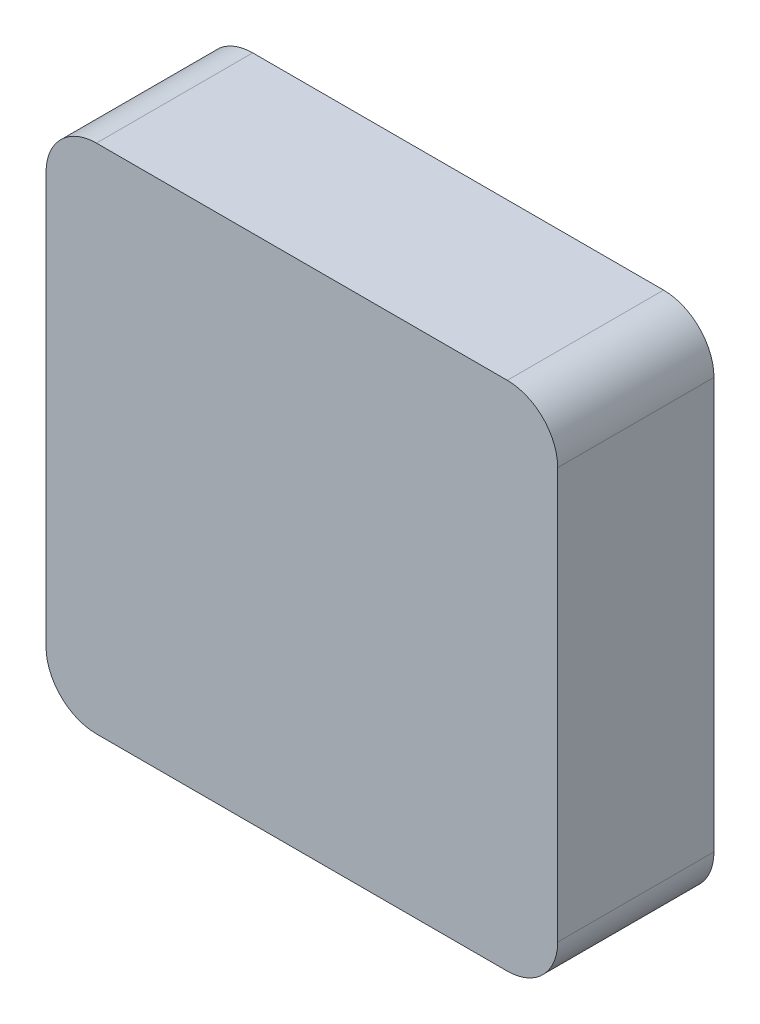
ISO-10303-21;
HEADER;
FILE_DESCRIPTION(('STEP AP214'),'2;1');
FILE_NAME('part.step','',(''),(''),'','','');
FILE_SCHEMA(('AUTOMOTIVE_DESIGN { 1 0 10303 214 1 1 1 1 }'));
ENDSEC;
DATA;
#1=APPLICATION_CONTEXT('core data for automotive mechanical design processes');
#2=APPLICATION_PROTOCOL_DEFINITION('international standard','automotive_design',2000,#1);
#3=PRODUCT_CONTEXT('',#1,'mechanical');
#4=PRODUCT('Part','Part','',(#3));
#5=PRODUCT_RELATED_PRODUCT_CATEGORY('part','',(#4));
#6=PRODUCT_DEFINITION_FORMATION('','',#4);
#7=PRODUCT_DEFINITION_CONTEXT('part definition',#1,'design');
#8=PRODUCT_DEFINITION('design','',#6,#7);
#9=PRODUCT_DEFINITION_SHAPE('','',#8);
#10=(LENGTH_UNIT() NAMED_UNIT(*) SI_UNIT(.MILLI.,.METRE.));
#11=(NAMED_UNIT(*) PLANE_ANGLE_UNIT() SI_UNIT($,.RADIAN.));
#12=(NAMED_UNIT(*) SI_UNIT($,.STERADIAN.) SOLID_ANGLE_UNIT());
#13=UNCERTAINTY_MEASURE_WITH_UNIT(LENGTH_MEASURE(1.E-05),#10,'distance_accuracy_value','');
#14=(GEOMETRIC_REPRESENTATION_CONTEXT(3) GLOBAL_UNCERTAINTY_ASSIGNED_CONTEXT((#13)) GLOBAL_UNIT_ASSIGNED_CONTEXT((#10,
#11,#12)) REPRESENTATION_CONTEXT('',''));
#15=CARTESIAN_POINT('',(0.,0.,0.));
#16=DIRECTION('',(0.,0.,1.));
#17=DIRECTION('',(1.,0.,0.));
#18=AXIS2_PLACEMENT_3D('',#15,#16,#17);
#19=CARTESIAN_POINT('',(-12.45,11.25,2.5));
#20=DIRECTION('',(0.,0.,1.));
#21=DIRECTION('',(1.,0.,0.));
#22=AXIS2_PLACEMENT_3D('',#19,#20,#21);
#23=PLANE('',#22);
#24=CARTESIAN_POINT('',(-16.52500000001,15.32500000001,2.50000000001));
#25=DIRECTION('',(0.,0.,1.));
#26=DIRECTION('',(0.,1.,0.));
#27=AXIS2_PLACEMENT_3D('',#24,#25,#26);
#28=CIRCLE('',#27,1.00000000001);
#29=CARTESIAN_POINT('',(-16.525,16.325,2.5));
#30=VERTEX_POINT('',#29);
#31=CARTESIAN_POINT('',(-17.525,15.325,2.5));
#32=VERTEX_POINT('',#31);
#33=EDGE_CURVE('E136',#30,#32,#28,.T.);
#34=ORIENTED_EDGE('',*,*,#33,.F.);
#35=DIRECTION('',(-1.,0.,0.));
#36=VECTOR('',#35,1.);
#37=CARTESIAN_POINT('',(-8.37500000001,16.32500000001,2.50000000001));
#38=LINE('',#37,#36);
#39=CARTESIAN_POINT('',(-8.375,16.325,2.5));
#40=VERTEX_POINT('',#39);
#41=EDGE_CURVE('E41',#40,#30,#38,.T.);
#42=ORIENTED_EDGE('',*,*,#41,.F.);
#43=CARTESIAN_POINT('',(-8.37500000001,15.32500000001,2.50000000001));
#44=DIRECTION('',(0.,0.,1.));
#45=DIRECTION('',(1.,0.,0.));
#46=AXIS2_PLACEMENT_3D('',#43,#44,#45);
#47=CIRCLE('',#46,1.00000000001);
#48=CARTESIAN_POINT('',(-7.375,15.325,2.5));
#49=VERTEX_POINT('',#48);
#50=EDGE_CURVE('E110',#49,#40,#47,.T.);
#51=ORIENTED_EDGE('',*,*,#50,.F.);
#52=DIRECTION('',(0.,1.,0.));
#53=VECTOR('',#52,1.);
#54=CARTESIAN_POINT('',(-7.37500000001,7.17500000001,2.50000000001));
#55=LINE('',#54,#53);
#56=CARTESIAN_POINT('',(-7.375,7.175,2.5));
#57=VERTEX_POINT('',#56);
#58=EDGE_CURVE('E99',#57,#49,#55,.T.);
#59=ORIENTED_EDGE('',*,*,#58,.F.);
#60=CARTESIAN_POINT('',(-8.37500000001,7.17500000001,2.50000000001));
#61=DIRECTION('',(0.,0.,1.));
#62=DIRECTION('',(0.,-1.,0.));
#63=AXIS2_PLACEMENT_3D('',#60,#61,#62);
#64=CIRCLE('',#63,1.00000000001);
#65=CARTESIAN_POINT('',(-8.375,6.175,2.5));
#66=VERTEX_POINT('',#65);
#67=EDGE_CURVE('E135',#66,#57,#64,.T.);
#68=ORIENTED_EDGE('',*,*,#67,.F.);
#69=DIRECTION('',(1.,0.,0.));
#70=VECTOR('',#69,1.);
#71=CARTESIAN_POINT('',(-16.52500000001,6.17500000001,2.50000000001));
#72=LINE('',#71,#70);
#73=CARTESIAN_POINT('',(-16.525,6.175,2.5));
#74=VERTEX_POINT('',#73);
#75=EDGE_CURVE('E21',#74,#66,#72,.T.);
#76=ORIENTED_EDGE('',*,*,#75,.F.);
#77=CARTESIAN_POINT('',(-16.52500000001,7.17500000001,2.50000000001));
#78=DIRECTION('',(0.,0.,1.));
#79=DIRECTION('',(-1.,0.,0.));
#80=AXIS2_PLACEMENT_3D('',#77,#78,#79);
#81=CIRCLE('',#80,1.00000000001);
#82=CARTESIAN_POINT('',(-17.525,7.175,2.5));
#83=VERTEX_POINT('',#82);
#84=EDGE_CURVE('E176',#83,#74,#81,.T.);
#85=ORIENTED_EDGE('',*,*,#84,.F.);
#86=DIRECTION('',(0.,-1.,0.));
#87=VECTOR('',#86,1.);
#88=CARTESIAN_POINT('',(-17.52500000001,15.32500000001,2.50000000001));
#89=LINE('',#88,#87);
#90=EDGE_CURVE('E28',#32,#83,#89,.T.);
#91=ORIENTED_EDGE('',*,*,#90,.F.);
#92=EDGE_LOOP('',(#34,#42,#51,#59,#68,#76,#85,#91));
#93=FACE_BOUND('',#92,.T.);
#94=ADVANCED_FACE('F17',(#93),#23,.F.);
#95=CARTESIAN_POINT('',(-17.525,7.5,0.));
#96=DIRECTION('',(1.,0.,0.));
#97=DIRECTION('',(0.,1.,0.));
#98=AXIS2_PLACEMENT_3D('',#95,#96,#97);
#99=PLANE('',#98);
#100=DIRECTION('',(0.,0.,-1.));
#101=VECTOR('',#100,1.);
#102=CARTESIAN_POINT('',(-17.52500000001,7.17500000001,5.60000000001));
#103=LINE('',#102,#101);
#104=CARTESIAN_POINT('',(-17.525,7.175,5.6));
#105=VERTEX_POINT('',#104);
#106=EDGE_CURVE('E173',#105,#83,#103,.T.);
#107=ORIENTED_EDGE('',*,*,#106,.F.);
#108=DIRECTION('',(0.,-1.,0.));
#109=VECTOR('',#108,1.);
#110=CARTESIAN_POINT('',(-17.52500000001,15.32500000001,5.60000000001));
#111=LINE('',#110,#109);
#112=CARTESIAN_POINT('',(-17.525,15.325,5.6));
#113=VERTEX_POINT('',#112);
#114=EDGE_CURVE('E149',#113,#105,#111,.T.);
#115=ORIENTED_EDGE('',*,*,#114,.F.);
#116=DIRECTION('',(0.,0.,-1.));
#117=VECTOR('',#116,1.);
#118=CARTESIAN_POINT('',(-17.52500000001,15.32500000001,5.60000000001));
#119=LINE('',#118,#117);
#120=EDGE_CURVE('E11',#113,#32,#119,.T.);
#121=ORIENTED_EDGE('',*,*,#120,.T.);
#122=ORIENTED_EDGE('',*,*,#90,.T.);
#123=EDGE_LOOP('',(#107,#115,#121,#122));
#124=FACE_BOUND('',#123,.T.);
#125=ADVANCED_FACE('F240',(#124),#99,.F.);
#126=CARTESIAN_POINT('',(-16.525,15.325,5.6));
#127=DIRECTION('',(0.,0.,1.));
#128=DIRECTION('',(0.,1.,0.));
#129=AXIS2_PLACEMENT_3D('',#126,#127,#128);
#130=CYLINDRICAL_SURFACE('',#129,1.);
#131=DIRECTION('',(0.,0.,-1.));
#132=VECTOR('',#131,1.);
#133=CARTESIAN_POINT('',(-16.52500000001,16.32500000001,5.60000000001));
#134=LINE('',#133,#132);
#135=CARTESIAN_POINT('',(-16.525,16.325,5.6));
#136=VERTEX_POINT('',#135);
#137=EDGE_CURVE('E139',#136,#30,#134,.T.);
#138=ORIENTED_EDGE('',*,*,#137,.T.);
#139=ORIENTED_EDGE('',*,*,#33,.T.);
#140=ORIENTED_EDGE('',*,*,#120,.F.);
#141=CARTESIAN_POINT('',(-16.52500000001,15.32500000001,5.60000000001));
#142=DIRECTION('',(0.,0.,1.));
#143=DIRECTION('',(0.,1.,0.));
#144=AXIS2_PLACEMENT_3D('',#141,#142,#143);
#145=CIRCLE('',#144,1.00000000001);
#146=EDGE_CURVE('E140',#136,#113,#145,.T.);
#147=ORIENTED_EDGE('',*,*,#146,.F.);
#148=EDGE_LOOP('',(#138,#139,#140,#147));
#149=FACE_BOUND('',#148,.T.);
#150=ADVANCED_FACE('F246',(#149),#130,.T.);
#151=CARTESIAN_POINT('',(0.,5.,5.6));
#152=DIRECTION('',(0.,0.,-1.));
#153=DIRECTION('',(0.,-1.,0.));
#154=AXIS2_PLACEMENT_3D('',#151,#152,#153);
#155=PLANE('',#154);
#156=ORIENTED_EDGE('',*,*,#146,.T.);
#157=ORIENTED_EDGE('',*,*,#114,.T.);
#158=CARTESIAN_POINT('',(-16.52500000001,7.17500000001,5.60000000001));
#159=DIRECTION('',(0.,0.,1.));
#160=DIRECTION('',(-1.,0.,0.));
#161=AXIS2_PLACEMENT_3D('',#158,#159,#160);
#162=CIRCLE('',#161,1.00000000001);
#163=CARTESIAN_POINT('',(-16.525,6.175,5.6));
#164=VERTEX_POINT('',#163);
#165=EDGE_CURVE('E145',#105,#164,#162,.T.);
#166=ORIENTED_EDGE('',*,*,#165,.T.);
#167=DIRECTION('',(1.,0.,0.));
#168=VECTOR('',#167,1.);
#169=CARTESIAN_POINT('',(-16.52500000001,6.17500000001,5.60000000001));
#170=LINE('',#169,#168);
#171=CARTESIAN_POINT('',(-8.375,6.175,5.6));
#172=VERTEX_POINT('',#171);
#173=EDGE_CURVE('E141',#164,#172,#170,.T.);
#174=ORIENTED_EDGE('',*,*,#173,.T.);
#175=CARTESIAN_POINT('',(-8.37500000001,7.17500000001,5.60000000001));
#176=DIRECTION('',(0.,0.,1.));
#177=DIRECTION('',(0.,-1.,0.));
#178=AXIS2_PLACEMENT_3D('',#175,#176,#177);
#179=CIRCLE('',#178,1.00000000001);
#180=CARTESIAN_POINT('',(-7.375,7.175,5.6));
#181=VERTEX_POINT('',#180);
#182=EDGE_CURVE('E146',#172,#181,#179,.T.);
#183=ORIENTED_EDGE('',*,*,#182,.T.);
#184=DIRECTION('',(0.,1.,0.));
#185=VECTOR('',#184,1.);
#186=CARTESIAN_POINT('',(-7.37500000001,7.17500000001,5.60000000001));
#187=LINE('',#186,#185);
#188=CARTESIAN_POINT('',(-7.375,15.325,5.6));
#189=VERTEX_POINT('',#188);
#190=EDGE_CURVE('E127',#181,#189,#187,.T.);
#191=ORIENTED_EDGE('',*,*,#190,.T.);
#192=CARTESIAN_POINT('',(-8.37500000001,15.32500000001,5.60000000001));
#193=DIRECTION('',(0.,0.,1.));
#194=DIRECTION('',(1.,0.,0.));
#195=AXIS2_PLACEMENT_3D('',#192,#193,#194);
#196=CIRCLE('',#195,1.00000000001);
#197=CARTESIAN_POINT('',(-8.375,16.325,5.6));
#198=VERTEX_POINT('',#197);
#199=EDGE_CURVE('E117',#189,#198,#196,.T.);
#200=ORIENTED_EDGE('',*,*,#199,.T.);
#201=DIRECTION('',(-1.,0.,0.));
#202=VECTOR('',#201,1.);
#203=CARTESIAN_POINT('',(-8.37500000001,16.32500000001,5.60000000001));
#204=LINE('',#203,#202);
#205=EDGE_CURVE('E128',#198,#136,#204,.T.);
#206=ORIENTED_EDGE('',*,*,#205,.T.);
#207=EDGE_LOOP('',(#156,#157,#166,#174,#183,#191,#200,#206));
#208=FACE_BOUND('',#207,.T.);
#209=ADVANCED_FACE('F195',(#208),#155,.F.);
#210=CARTESIAN_POINT('',(-16.2,16.325,0.));
#211=DIRECTION('',(0.,-1.,0.));
#212=DIRECTION('',(0.,0.,-1.));
#213=AXIS2_PLACEMENT_3D('',#210,#211,#212);
#214=PLANE('',#213);
#215=DIRECTION('',(0.,0.,-1.));
#216=VECTOR('',#215,1.);
#217=CARTESIAN_POINT('',(-8.37500000001,16.32500000001,5.60000000001));
#218=LINE('',#217,#216);
#219=EDGE_CURVE('E123',#198,#40,#218,.T.);
#220=ORIENTED_EDGE('',*,*,#219,.T.);
#221=ORIENTED_EDGE('',*,*,#41,.T.);
#222=ORIENTED_EDGE('',*,*,#137,.F.);
#223=ORIENTED_EDGE('',*,*,#205,.F.);
#224=EDGE_LOOP('',(#220,#221,#222,#223));
#225=FACE_BOUND('',#224,.T.);
#226=ADVANCED_FACE('F249',(#225),#214,.F.);
#227=CARTESIAN_POINT('',(-8.375,15.325,5.6));
#228=DIRECTION('',(0.,0.,1.));
#229=DIRECTION('',(0.,1.,0.));
#230=AXIS2_PLACEMENT_3D('',#227,#228,#229);
#231=CYLINDRICAL_SURFACE('',#230,1.);
#232=DIRECTION('',(0.,0.,-1.));
#233=VECTOR('',#232,1.);
#234=CARTESIAN_POINT('',(-7.37500000001,15.32500000001,5.60000000001));
#235=LINE('',#234,#233);
#236=EDGE_CURVE('E102',#189,#49,#235,.T.);
#237=ORIENTED_EDGE('',*,*,#236,.T.);
#238=ORIENTED_EDGE('',*,*,#50,.T.);
#239=ORIENTED_EDGE('',*,*,#219,.F.);
#240=ORIENTED_EDGE('',*,*,#199,.F.);
#241=EDGE_LOOP('',(#237,#238,#239,#240));
#242=FACE_BOUND('',#241,.T.);
#243=ADVANCED_FACE('F115',(#242),#231,.T.);
#244=CARTESIAN_POINT('',(-7.375,15.,0.));
#245=DIRECTION('',(-1.,0.,0.));
#246=DIRECTION('',(0.,0.,1.));
#247=AXIS2_PLACEMENT_3D('',#244,#245,#246);
#248=PLANE('',#247);
#249=ORIENTED_EDGE('',*,*,#236,.F.);
#250=ORIENTED_EDGE('',*,*,#190,.F.);
#251=DIRECTION('',(0.,0.,-1.));
#252=VECTOR('',#251,1.);
#253=CARTESIAN_POINT('',(-7.37500000001,7.17500000001,5.60000000001));
#254=LINE('',#253,#252);
#255=EDGE_CURVE('E104',#181,#57,#254,.T.);
#256=ORIENTED_EDGE('',*,*,#255,.T.);
#257=ORIENTED_EDGE('',*,*,#58,.T.);
#258=EDGE_LOOP('',(#249,#250,#256,#257));
#259=FACE_BOUND('',#258,.T.);
#260=ADVANCED_FACE('F19',(#259),#248,.F.);
#261=CARTESIAN_POINT('',(-8.375,7.175,5.6));
#262=DIRECTION('',(0.,0.,1.));
#263=DIRECTION('',(0.,1.,0.));
#264=AXIS2_PLACEMENT_3D('',#261,#262,#263);
#265=CYLINDRICAL_SURFACE('',#264,1.);
#266=DIRECTION('',(0.,0.,-1.));
#267=VECTOR('',#266,1.);
#268=CARTESIAN_POINT('',(-8.37500000001,6.17500000001,5.60000000001));
#269=LINE('',#268,#267);
#270=EDGE_CURVE('E108',#172,#66,#269,.T.);
#271=ORIENTED_EDGE('',*,*,#270,.T.);
#272=ORIENTED_EDGE('',*,*,#67,.T.);
#273=ORIENTED_EDGE('',*,*,#255,.F.);
#274=ORIENTED_EDGE('',*,*,#182,.F.);
#275=EDGE_LOOP('',(#271,#272,#273,#274));
#276=FACE_BOUND('',#275,.T.);
#277=ADVANCED_FACE('F205',(#276),#265,.T.);
#278=CARTESIAN_POINT('',(-8.7,6.175,0.));
#279=DIRECTION('',(0.,1.,0.));
#280=DIRECTION('',(1.,0.,0.));
#281=AXIS2_PLACEMENT_3D('',#278,#279,#280);
#282=PLANE('',#281);
#283=ORIENTED_EDGE('',*,*,#270,.F.);
#284=ORIENTED_EDGE('',*,*,#173,.F.);
#285=DIRECTION('',(0.,0.,-1.));
#286=VECTOR('',#285,1.);
#287=CARTESIAN_POINT('',(-16.52500000001,6.17500000001,5.60000000001));
#288=LINE('',#287,#286);
#289=EDGE_CURVE('E153',#164,#74,#288,.T.);
#290=ORIENTED_EDGE('',*,*,#289,.T.);
#291=ORIENTED_EDGE('',*,*,#75,.T.);
#292=EDGE_LOOP('',(#283,#284,#290,#291));
#293=FACE_BOUND('',#292,.T.);
#294=ADVANCED_FACE('F192',(#293),#282,.F.);
#295=CARTESIAN_POINT('',(-16.525,7.175,5.6));
#296=DIRECTION('',(0.,0.,1.));
#297=DIRECTION('',(0.,1.,0.));
#298=AXIS2_PLACEMENT_3D('',#295,#296,#297);
#299=CYLINDRICAL_SURFACE('',#298,1.);
#300=ORIENTED_EDGE('',*,*,#106,.T.);
#301=ORIENTED_EDGE('',*,*,#84,.T.);
#302=ORIENTED_EDGE('',*,*,#289,.F.);
#303=ORIENTED_EDGE('',*,*,#165,.F.);
#304=EDGE_LOOP('',(#300,#301,#302,#303));
#305=FACE_BOUND('',#304,.T.);
#306=ADVANCED_FACE('F184',(#305),#299,.T.);
#307=CLOSED_SHELL('',(#94,#125,#150,#209,#226,#243,#260,#277,#294,#306));
#308=MANIFOLD_SOLID_BREP('B1',#307);
#309=ADVANCED_BREP_SHAPE_REPRESENTATION('',(#18,#308),#14);
#310=SHAPE_DEFINITION_REPRESENTATION(#9,#309);
ENDSEC;
END-ISO-10303-21;
